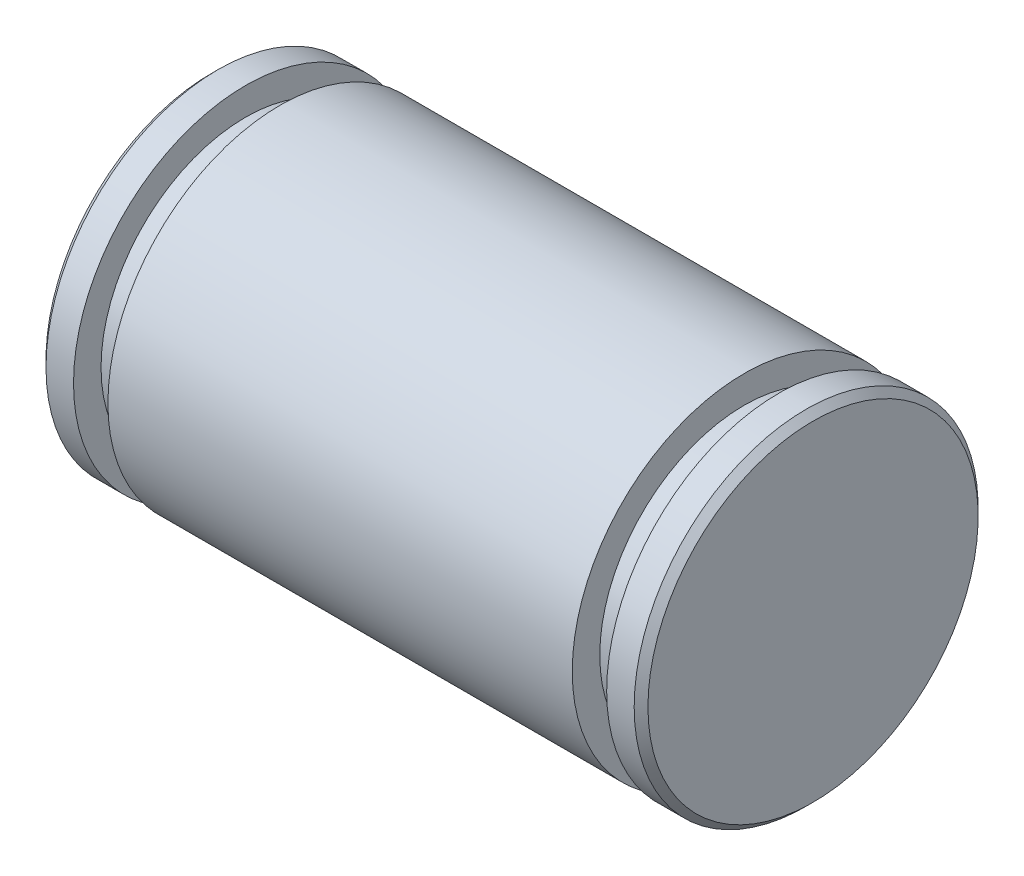
ISO-10303-21;
HEADER;
FILE_DESCRIPTION(('STEP AP214'),'2;1');
FILE_NAME('part.step','',(''),(''),'','','');
FILE_SCHEMA(('AUTOMOTIVE_DESIGN { 1 0 10303 214 1 1 1 1 }'));
ENDSEC;
DATA;
#1=APPLICATION_CONTEXT('core data for automotive mechanical design processes');
#2=APPLICATION_PROTOCOL_DEFINITION('international standard','automotive_design',2000,#1);
#3=PRODUCT_CONTEXT('',#1,'mechanical');
#4=PRODUCT('Part','Part','',(#3));
#5=PRODUCT_RELATED_PRODUCT_CATEGORY('part','',(#4));
#6=PRODUCT_DEFINITION_FORMATION('','',#4);
#7=PRODUCT_DEFINITION_CONTEXT('part definition',#1,'design');
#8=PRODUCT_DEFINITION('design','',#6,#7);
#9=PRODUCT_DEFINITION_SHAPE('','',#8);
#10=(LENGTH_UNIT() NAMED_UNIT(*) SI_UNIT(.MILLI.,.METRE.));
#11=(NAMED_UNIT(*) PLANE_ANGLE_UNIT() SI_UNIT($,.RADIAN.));
#12=(NAMED_UNIT(*) SI_UNIT($,.STERADIAN.) SOLID_ANGLE_UNIT());
#13=UNCERTAINTY_MEASURE_WITH_UNIT(LENGTH_MEASURE(1.E-05),#10,'distance_accuracy_value','');
#14=(GEOMETRIC_REPRESENTATION_CONTEXT(3) GLOBAL_UNCERTAINTY_ASSIGNED_CONTEXT((#13)) GLOBAL_UNIT_ASSIGNED_CONTEXT((#10,
#11,#12)) REPRESENTATION_CONTEXT('',''));
#15=CARTESIAN_POINT('',(0.,0.,0.));
#16=DIRECTION('',(0.,0.,1.));
#17=DIRECTION('',(1.,0.,0.));
#18=AXIS2_PLACEMENT_3D('',#15,#16,#17);
#19=CARTESIAN_POINT('',(17.5,4.8,0.));
#20=DIRECTION('',(-1.,0.,0.));
#21=DIRECTION('',(0.,0.,1.));
#22=AXIS2_PLACEMENT_3D('',#19,#20,#21);
#23=PLANE('',#22);
#24=CARTESIAN_POINT('',(17.5000000000409,0.,0.));
#25=DIRECTION('',(-1.,0.,0.));
#26=DIRECTION('',(0.,0.,1.));
#27=AXIS2_PLACEMENT_3D('',#24,#25,#26);
#28=CIRCLE('',#27,4.79999999993197);
#29=CARTESIAN_POINT('',(17.5000000000409,0.,4.79999999993197));
#30=VERTEX_POINT('',#29);
#31=EDGE_CURVE('E17',#30,#30,#28,.T.);
#32=ORIENTED_EDGE('',*,*,#31,.F.);
#33=EDGE_LOOP('',(#32));
#34=FACE_BOUND('',#33,.T.);
#35=ADVANCED_FACE('F14',(#34),#23,.F.);
#36=CARTESIAN_POINT('',(0.,0.,0.));
#37=DIRECTION('',(1.,0.,0.));
#38=DIRECTION('',(0.,0.,-1.));
#39=AXIS2_PLACEMENT_3D('',#36,#37,#38);
#40=PLANE('',#39);
#41=CARTESIAN_POINT('',(5.6843418860808E-11,0.,0.));
#42=DIRECTION('',(1.,0.,0.));
#43=DIRECTION('',(0.,0.,-1.));
#44=AXIS2_PLACEMENT_3D('',#41,#42,#43);
#45=CIRCLE('',#44,4.79999999998881);
#46=CARTESIAN_POINT('',(5.6843418860808E-11,0.,-4.79999999998881));
#47=VERTEX_POINT('',#46);
#48=EDGE_CURVE('E49',#47,#47,#45,.T.);
#49=ORIENTED_EDGE('',*,*,#48,.F.);
#50=EDGE_LOOP('',(#49));
#51=FACE_BOUND('',#50,.T.);
#52=ADVANCED_FACE('F60',(#51),#40,.F.);
#53=CARTESIAN_POINT('',(17.2999999999206,0.,0.));
#54=DIRECTION('',(-1.,0.,0.));
#55=DIRECTION('',(0.,0.,1.));
#56=AXIS2_PLACEMENT_3D('',#53,#54,#55);
#57=CONICAL_SURFACE('',#56,5.0000000000523,0.785398163397448);
#58=CARTESIAN_POINT('',(17.3,0.,0.));
#59=DIRECTION('',(-1.,0.,0.));
#60=DIRECTION('',(0.,0.,1.));
#61=AXIS2_PLACEMENT_3D('',#58,#59,#60);
#62=CIRCLE('',#61,5.);
#63=CARTESIAN_POINT('',(17.3,0.,5.));
#64=VERTEX_POINT('',#63);
#65=EDGE_CURVE('E29',#64,#64,#62,.T.);
#66=ORIENTED_EDGE('',*,*,#65,.F.);
#67=EDGE_LOOP('',(#66));
#68=FACE_BOUND('',#67,.T.);
#69=ORIENTED_EDGE('',*,*,#31,.T.);
#70=EDGE_LOOP('',(#69));
#71=FACE_BOUND('',#70,.T.);
#72=ADVANCED_FACE('F57',(#68,#71),#57,.T.);
#73=CARTESIAN_POINT('',(0.200000000006639,0.,0.));
#74=DIRECTION('',(1.,0.,0.));
#75=DIRECTION('',(0.,0.,-1.));
#76=AXIS2_PLACEMENT_3D('',#73,#74,#75);
#77=CONICAL_SURFACE('',#76,4.99999999993861,0.785398163397448);
#78=CARTESIAN_POINT('',(0.200000000000006,0.,0.));
#79=DIRECTION('',(-1.,0.,0.));
#80=DIRECTION('',(0.,0.,1.));
#81=AXIS2_PLACEMENT_3D('',#78,#79,#80);
#82=CIRCLE('',#81,5.);
#83=CARTESIAN_POINT('',(0.200000000000006,0.,5.));
#84=VERTEX_POINT('',#83);
#85=EDGE_CURVE('E48',#84,#84,#82,.F.);
#86=ORIENTED_EDGE('',*,*,#85,.F.);
#87=EDGE_LOOP('',(#86));
#88=FACE_BOUND('',#87,.T.);
#89=ORIENTED_EDGE('',*,*,#48,.T.);
#90=EDGE_LOOP('',(#89));
#91=FACE_BOUND('',#90,.T.);
#92=ADVANCED_FACE('F105',(#88,#91),#77,.T.);
#93=CARTESIAN_POINT('',(-138.084352936582,0.,0.));
#94=DIRECTION('',(-1.,0.,0.));
#95=DIRECTION('',(0.,0.,1.));
#96=AXIS2_PLACEMENT_3D('',#93,#94,#95);
#97=CYLINDRICAL_SURFACE('',#96,5.);
#98=CARTESIAN_POINT('',(16.5,0.,0.));
#99=DIRECTION('',(-1.,0.,0.));
#100=DIRECTION('',(0.,0.,1.));
#101=AXIS2_PLACEMENT_3D('',#98,#99,#100);
#102=CIRCLE('',#101,5.);
#103=CARTESIAN_POINT('',(16.5,0.,5.));
#104=VERTEX_POINT('',#103);
#105=EDGE_CURVE('E46',#104,#104,#102,.F.);
#106=ORIENTED_EDGE('',*,*,#105,.T.);
#107=EDGE_LOOP('',(#106));
#108=FACE_BOUND('',#107,.T.);
#109=ORIENTED_EDGE('',*,*,#65,.T.);
#110=EDGE_LOOP('',(#109));
#111=FACE_BOUND('',#110,.T.);
#112=ADVANCED_FACE('F101',(#108,#111),#97,.T.);
#113=CARTESIAN_POINT('',(-138.084352936582,0.,0.));
#114=DIRECTION('',(-1.,0.,0.));
#115=DIRECTION('',(0.,0.,1.));
#116=AXIS2_PLACEMENT_3D('',#113,#114,#115);
#117=CYLINDRICAL_SURFACE('',#116,5.);
#118=ORIENTED_EDGE('',*,*,#85,.T.);
#119=EDGE_LOOP('',(#118));
#120=FACE_BOUND('',#119,.T.);
#121=CARTESIAN_POINT('',(1.,0.,0.));
#122=DIRECTION('',(-1.,0.,0.));
#123=DIRECTION('',(0.,0.,1.));
#124=AXIS2_PLACEMENT_3D('',#121,#122,#123);
#125=CIRCLE('',#124,5.);
#126=CARTESIAN_POINT('',(1.,0.,5.));
#127=VERTEX_POINT('',#126);
#128=EDGE_CURVE('E43',#127,#127,#125,.T.);
#129=ORIENTED_EDGE('',*,*,#128,.T.);
#130=EDGE_LOOP('',(#129));
#131=FACE_BOUND('',#130,.T.);
#132=ADVANCED_FACE('F97',(#120,#131),#117,.T.);
#133=CARTESIAN_POINT('',(16.5,4.2,0.));
#134=DIRECTION('',(1.,0.,0.));
#135=DIRECTION('',(0.,0.,-1.));
#136=AXIS2_PLACEMENT_3D('',#133,#134,#135);
#137=PLANE('',#136);
#138=ORIENTED_EDGE('',*,*,#105,.F.);
#139=EDGE_LOOP('',(#138));
#140=FACE_BOUND('',#139,.T.);
#141=CARTESIAN_POINT('',(16.5,0.,0.));
#142=DIRECTION('',(-1.,0.,0.));
#143=DIRECTION('',(0.,0.,1.));
#144=AXIS2_PLACEMENT_3D('',#141,#142,#143);
#145=CIRCLE('',#144,4.2);
#146=CARTESIAN_POINT('',(16.5,0.,4.2));
#147=VERTEX_POINT('',#146);
#148=EDGE_CURVE('E40',#147,#147,#145,.T.);
#149=ORIENTED_EDGE('',*,*,#148,.F.);
#150=EDGE_LOOP('',(#149));
#151=FACE_BOUND('',#150,.T.);
#152=ADVANCED_FACE('F93',(#140,#151),#137,.F.);
#153=CARTESIAN_POINT('',(1.,5.,0.));
#154=DIRECTION('',(-1.,0.,0.));
#155=DIRECTION('',(0.,0.,1.));
#156=AXIS2_PLACEMENT_3D('',#153,#154,#155);
#157=PLANE('',#156);
#158=CARTESIAN_POINT('',(1.,0.,0.));
#159=DIRECTION('',(-1.,0.,0.));
#160=DIRECTION('',(0.,0.,1.));
#161=AXIS2_PLACEMENT_3D('',#158,#159,#160);
#162=CIRCLE('',#161,4.2);
#163=CARTESIAN_POINT('',(1.,0.,4.2));
#164=VERTEX_POINT('',#163);
#165=EDGE_CURVE('E37',#164,#164,#162,.F.);
#166=ORIENTED_EDGE('',*,*,#165,.F.);
#167=EDGE_LOOP('',(#166));
#168=FACE_BOUND('',#167,.T.);
#169=ORIENTED_EDGE('',*,*,#128,.F.);
#170=EDGE_LOOP('',(#169));
#171=FACE_BOUND('',#170,.T.);
#172=ADVANCED_FACE('F89',(#168,#171),#157,.F.);
#173=CARTESIAN_POINT('',(-138.084352936582,0.,0.));
#174=DIRECTION('',(-1.,0.,0.));
#175=DIRECTION('',(0.,0.,1.));
#176=AXIS2_PLACEMENT_3D('',#173,#174,#175);
#177=CYLINDRICAL_SURFACE('',#176,4.2);
#178=CARTESIAN_POINT('',(15.5,0.,0.));
#179=DIRECTION('',(-1.,0.,0.));
#180=DIRECTION('',(0.,0.,1.));
#181=AXIS2_PLACEMENT_3D('',#178,#179,#180);
#182=CIRCLE('',#181,4.2);
#183=CARTESIAN_POINT('',(15.5,0.,4.2));
#184=VERTEX_POINT('',#183);
#185=EDGE_CURVE('E34',#184,#184,#182,.F.);
#186=ORIENTED_EDGE('',*,*,#185,.T.);
#187=EDGE_LOOP('',(#186));
#188=FACE_BOUND('',#187,.T.);
#189=ORIENTED_EDGE('',*,*,#148,.T.);
#190=EDGE_LOOP('',(#189));
#191=FACE_BOUND('',#190,.T.);
#192=ADVANCED_FACE('F85',(#188,#191),#177,.T.);
#193=CARTESIAN_POINT('',(-138.084352936582,0.,0.));
#194=DIRECTION('',(-1.,0.,0.));
#195=DIRECTION('',(0.,0.,1.));
#196=AXIS2_PLACEMENT_3D('',#193,#194,#195);
#197=CYLINDRICAL_SURFACE('',#196,4.2);
#198=ORIENTED_EDGE('',*,*,#165,.T.);
#199=EDGE_LOOP('',(#198));
#200=FACE_BOUND('',#199,.T.);
#201=CARTESIAN_POINT('',(2.,0.,0.));
#202=DIRECTION('',(-1.,0.,0.));
#203=DIRECTION('',(0.,0.,1.));
#204=AXIS2_PLACEMENT_3D('',#201,#202,#203);
#205=CIRCLE('',#204,4.2);
#206=CARTESIAN_POINT('',(2.,0.,4.2));
#207=VERTEX_POINT('',#206);
#208=EDGE_CURVE('E26',#207,#207,#205,.T.);
#209=ORIENTED_EDGE('',*,*,#208,.T.);
#210=EDGE_LOOP('',(#209));
#211=FACE_BOUND('',#210,.T.);
#212=ADVANCED_FACE('F81',(#200,#211),#197,.T.);
#213=CARTESIAN_POINT('',(15.5,5.,0.));
#214=DIRECTION('',(-1.,0.,0.));
#215=DIRECTION('',(0.,0.,1.));
#216=AXIS2_PLACEMENT_3D('',#213,#214,#215);
#217=PLANE('',#216);
#218=ORIENTED_EDGE('',*,*,#185,.F.);
#219=EDGE_LOOP('',(#218));
#220=FACE_BOUND('',#219,.T.);
#221=CARTESIAN_POINT('',(15.5,0.,0.));
#222=DIRECTION('',(-1.,0.,0.));
#223=DIRECTION('',(0.,0.,1.));
#224=AXIS2_PLACEMENT_3D('',#221,#222,#223);
#225=CIRCLE('',#224,5.);
#226=CARTESIAN_POINT('',(15.5,0.,5.));
#227=VERTEX_POINT('',#226);
#228=EDGE_CURVE('E21',#227,#227,#225,.T.);
#229=ORIENTED_EDGE('',*,*,#228,.F.);
#230=EDGE_LOOP('',(#229));
#231=FACE_BOUND('',#230,.T.);
#232=ADVANCED_FACE('F74',(#220,#231),#217,.F.);
#233=CARTESIAN_POINT('',(2.,4.2,0.));
#234=DIRECTION('',(1.,0.,0.));
#235=DIRECTION('',(0.,0.,-1.));
#236=AXIS2_PLACEMENT_3D('',#233,#234,#235);
#237=PLANE('',#236);
#238=CARTESIAN_POINT('',(2.,0.,0.));
#239=DIRECTION('',(-1.,0.,0.));
#240=DIRECTION('',(0.,0.,1.));
#241=AXIS2_PLACEMENT_3D('',#238,#239,#240);
#242=CIRCLE('',#241,5.);
#243=CARTESIAN_POINT('',(2.,0.,5.));
#244=VERTEX_POINT('',#243);
#245=EDGE_CURVE('E10',#244,#244,#242,.F.);
#246=ORIENTED_EDGE('',*,*,#245,.F.);
#247=EDGE_LOOP('',(#246));
#248=FACE_BOUND('',#247,.T.);
#249=ORIENTED_EDGE('',*,*,#208,.F.);
#250=EDGE_LOOP('',(#249));
#251=FACE_BOUND('',#250,.T.);
#252=ADVANCED_FACE('F68',(#248,#251),#237,.F.);
#253=CARTESIAN_POINT('',(-138.084352936582,0.,0.));
#254=DIRECTION('',(-1.,0.,0.));
#255=DIRECTION('',(0.,0.,1.));
#256=AXIS2_PLACEMENT_3D('',#253,#254,#255);
#257=CYLINDRICAL_SURFACE('',#256,5.);
#258=ORIENTED_EDGE('',*,*,#245,.T.);
#259=EDGE_LOOP('',(#258));
#260=FACE_BOUND('',#259,.T.);
#261=ORIENTED_EDGE('',*,*,#228,.T.);
#262=EDGE_LOOP('',(#261));
#263=FACE_BOUND('',#262,.T.);
#264=ADVANCED_FACE('F66',(#260,#263),#257,.T.);
#265=CLOSED_SHELL('',(#35,#52,#72,#92,#112,#132,#152,#172,#192,#212,#232,#252,#264));
#266=MANIFOLD_SOLID_BREP('B1',#265);
#267=ADVANCED_BREP_SHAPE_REPRESENTATION('',(#18,#266),#14);
#268=SHAPE_DEFINITION_REPRESENTATION(#9,#267);
ENDSEC;
END-ISO-10303-21;
